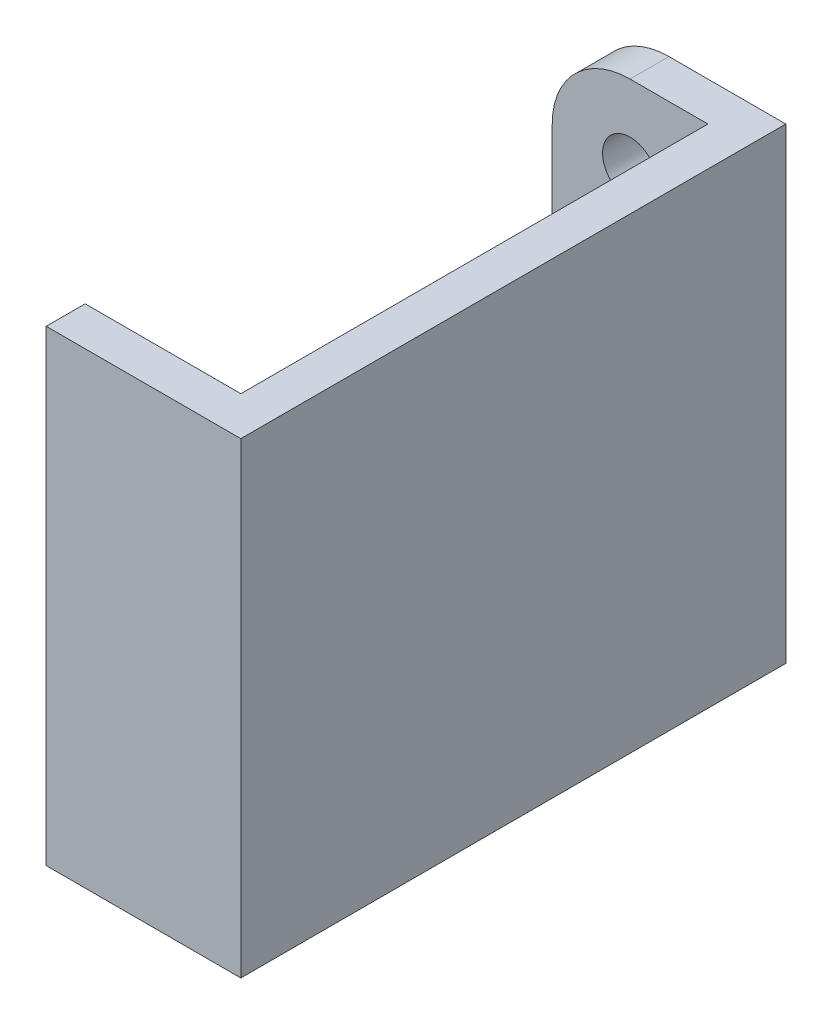
ISO-10303-21;
HEADER;
FILE_DESCRIPTION(('STEP AP214'),'2;1');
FILE_NAME('part.step','',(''),(''),'','','');
FILE_SCHEMA(('AUTOMOTIVE_DESIGN { 1 0 10303 214 1 1 1 1 }'));
ENDSEC;
DATA;
#1=APPLICATION_CONTEXT('core data for automotive mechanical design processes');
#2=APPLICATION_PROTOCOL_DEFINITION('international standard','automotive_design',2000,#1);
#3=PRODUCT_CONTEXT('',#1,'mechanical');
#4=PRODUCT('Part','Part','',(#3));
#5=PRODUCT_RELATED_PRODUCT_CATEGORY('part','',(#4));
#6=PRODUCT_DEFINITION_FORMATION('','',#4);
#7=PRODUCT_DEFINITION_CONTEXT('part definition',#1,'design');
#8=PRODUCT_DEFINITION('design','',#6,#7);
#9=PRODUCT_DEFINITION_SHAPE('','',#8);
#10=(LENGTH_UNIT() NAMED_UNIT(*) SI_UNIT(.MILLI.,.METRE.));
#11=(NAMED_UNIT(*) PLANE_ANGLE_UNIT() SI_UNIT($,.RADIAN.));
#12=(NAMED_UNIT(*) SI_UNIT($,.STERADIAN.) SOLID_ANGLE_UNIT());
#13=UNCERTAINTY_MEASURE_WITH_UNIT(LENGTH_MEASURE(1.E-05),#10,'distance_accuracy_value','');
#14=(GEOMETRIC_REPRESENTATION_CONTEXT(3) GLOBAL_UNCERTAINTY_ASSIGNED_CONTEXT((#13)) GLOBAL_UNIT_ASSIGNED_CONTEXT((#10,
#11,#12)) REPRESENTATION_CONTEXT('',''));
#15=CARTESIAN_POINT('',(0.,0.,0.));
#16=DIRECTION('',(0.,0.,1.));
#17=DIRECTION('',(1.,0.,0.));
#18=AXIS2_PLACEMENT_3D('',#15,#16,#17);
#19=CARTESIAN_POINT('',(-7.9375,19.05,-44.45));
#20=DIRECTION('',(-1.,0.,0.));
#21=DIRECTION('',(0.,-1.,0.));
#22=AXIS2_PLACEMENT_3D('',#19,#20,#21);
#23=PLANE('',#22);
#24=DIRECTION('',(0.,-1.,0.));
#25=VECTOR('',#24,1.);
#26=CARTESIAN_POINT('',(-7.9375,0.,-41.275));
#27=LINE('',#26,#25);
#28=CARTESIAN_POINT('',(-7.9375,12.7,-41.275));
#29=VERTEX_POINT('',#28);
#30=CARTESIAN_POINT('',(-7.9375,-15.875,-41.275));
#31=VERTEX_POINT('',#30);
#32=EDGE_CURVE('E138',#29,#31,#27,.T.);
#33=ORIENTED_EDGE('',*,*,#32,.F.);
#34=DIRECTION('',(0.,0.,1.));
#35=VECTOR('',#34,1.);
#36=CARTESIAN_POINT('',(-7.9375,12.7,-44.45));
#37=LINE('',#36,#35);
#38=CARTESIAN_POINT('',(-7.9375,12.7,-44.45));
#39=VERTEX_POINT('',#38);
#40=EDGE_CURVE('E52',#29,#39,#37,.F.);
#41=ORIENTED_EDGE('',*,*,#40,.T.);
#42=DIRECTION('',(0.,-1.,0.));
#43=VECTOR('',#42,1.);
#44=CARTESIAN_POINT('',(-7.9375,19.05,-44.45));
#45=LINE('',#44,#43);
#46=CARTESIAN_POINT('',(-7.9375,-19.05,-44.45));
#47=VERTEX_POINT('',#46);
#48=EDGE_CURVE('E169',#39,#47,#45,.T.);
#49=ORIENTED_EDGE('',*,*,#48,.T.);
#50=DIRECTION('',(0.,0.,1.));
#51=VECTOR('',#50,1.);
#52=CARTESIAN_POINT('',(-7.9375,-19.05,-44.45));
#53=LINE('',#52,#51);
#54=CARTESIAN_POINT('',(-7.9375,-19.05,0.));
#55=VERTEX_POINT('',#54);
#56=EDGE_CURVE('E195',#47,#55,#53,.T.);
#57=ORIENTED_EDGE('',*,*,#56,.T.);
#58=DIRECTION('',(0.,-1.,0.));
#59=VECTOR('',#58,1.);
#60=CARTESIAN_POINT('',(-7.9375,19.05,0.));
#61=LINE('',#60,#59);
#62=CARTESIAN_POINT('',(-7.9375,19.05,0.));
#63=VERTEX_POINT('',#62);
#64=EDGE_CURVE('E184',#63,#55,#61,.T.);
#65=ORIENTED_EDGE('',*,*,#64,.F.);
#66=DIRECTION('',(0.,0.,1.));
#67=VECTOR('',#66,1.);
#68=CARTESIAN_POINT('',(-7.9375,19.05,-44.45));
#69=LINE('',#68,#67);
#70=CARTESIAN_POINT('',(-7.9375,19.05,-3.175));
#71=VERTEX_POINT('',#70);
#72=EDGE_CURVE('E198',#71,#63,#69,.T.);
#73=ORIENTED_EDGE('',*,*,#72,.F.);
#74=DIRECTION('',(0.,-1.,0.));
#75=VECTOR('',#74,1.);
#76=CARTESIAN_POINT('',(-7.9375,0.,-3.175));
#77=LINE('',#76,#75);
#78=CARTESIAN_POINT('',(-7.9375,-15.875,-3.175));
#79=VERTEX_POINT('',#78);
#80=EDGE_CURVE('E151',#71,#79,#77,.T.);
#81=ORIENTED_EDGE('',*,*,#80,.T.);
#82=DIRECTION('',(0.,0.,1.));
#83=VECTOR('',#82,1.);
#84=CARTESIAN_POINT('',(-7.9375,-15.875,-44.45));
#85=LINE('',#84,#83);
#86=EDGE_CURVE('E126',#31,#79,#85,.T.);
#87=ORIENTED_EDGE('',*,*,#86,.F.);
#88=EDGE_LOOP('',(#33,#41,#49,#57,#65,#73,#81,#87));
#89=FACE_BOUND('',#88,.T.);
#90=ADVANCED_FACE('F43',(#89),#23,.T.);
#91=CARTESIAN_POINT('',(-7.9375,19.05,-44.45));
#92=DIRECTION('',(0.,1.,0.));
#93=DIRECTION('',(0.,0.,1.));
#94=AXIS2_PLACEMENT_3D('',#91,#92,#93);
#95=PLANE('',#94);
#96=DIRECTION('',(-1.,0.,0.));
#97=VECTOR('',#96,1.);
#98=CARTESIAN_POINT('',(-7.9375,19.05,-44.45));
#99=LINE('',#98,#97);
#100=CARTESIAN_POINT('',(7.9375,19.05,-44.45));
#101=VERTEX_POINT('',#100);
#102=CARTESIAN_POINT('',(-1.5875,19.05,-44.45));
#103=VERTEX_POINT('',#102);
#104=EDGE_CURVE('E164',#101,#103,#99,.T.);
#105=ORIENTED_EDGE('',*,*,#104,.T.);
#106=DIRECTION('',(0.,0.,1.));
#107=VECTOR('',#106,1.);
#108=CARTESIAN_POINT('',(-1.5875,19.05,-44.45));
#109=LINE('',#108,#107);
#110=CARTESIAN_POINT('',(-1.5875,19.05,-41.275));
#111=VERTEX_POINT('',#110);
#112=EDGE_CURVE('E194',#103,#111,#109,.T.);
#113=ORIENTED_EDGE('',*,*,#112,.T.);
#114=DIRECTION('',(-1.,0.,0.));
#115=VECTOR('',#114,1.);
#116=CARTESIAN_POINT('',(0.,19.05,-41.275));
#117=LINE('',#116,#115);
#118=CARTESIAN_POINT('',(4.7625,19.05,-41.275));
#119=VERTEX_POINT('',#118);
#120=EDGE_CURVE('E135',#119,#111,#117,.T.);
#121=ORIENTED_EDGE('',*,*,#120,.F.);
#122=DIRECTION('',(0.,0.,1.));
#123=VECTOR('',#122,1.);
#124=CARTESIAN_POINT('',(4.7625,19.05,-44.45));
#125=LINE('',#124,#123);
#126=CARTESIAN_POINT('',(4.7625,19.05,-3.175));
#127=VERTEX_POINT('',#126);
#128=EDGE_CURVE('E132',#119,#127,#125,.T.);
#129=ORIENTED_EDGE('',*,*,#128,.T.);
#130=DIRECTION('',(-1.,0.,0.));
#131=VECTOR('',#130,1.);
#132=CARTESIAN_POINT('',(0.,19.05,-3.175));
#133=LINE('',#132,#131);
#134=EDGE_CURVE('E155',#127,#71,#133,.T.);
#135=ORIENTED_EDGE('',*,*,#134,.T.);
#136=ORIENTED_EDGE('',*,*,#72,.T.);
#137=DIRECTION('',(-1.,0.,0.));
#138=VECTOR('',#137,1.);
#139=CARTESIAN_POINT('',(-7.9375,19.05,0.));
#140=LINE('',#139,#138);
#141=CARTESIAN_POINT('',(7.9375,19.05,0.));
#142=VERTEX_POINT('',#141);
#143=EDGE_CURVE('E180',#142,#63,#140,.T.);
#144=ORIENTED_EDGE('',*,*,#143,.F.);
#145=DIRECTION('',(0.,0.,1.));
#146=VECTOR('',#145,1.);
#147=CARTESIAN_POINT('',(7.9375,19.05,-44.45));
#148=LINE('',#147,#146);
#149=EDGE_CURVE('E176',#101,#142,#148,.T.);
#150=ORIENTED_EDGE('',*,*,#149,.F.);
#151=EDGE_LOOP('',(#105,#113,#121,#129,#135,#136,#144,#150));
#152=FACE_BOUND('',#151,.T.);
#153=ADVANCED_FACE('F210',(#152),#95,.T.);
#154=CARTESIAN_POINT('',(7.9375,19.05,-44.45));
#155=DIRECTION('',(1.,0.,0.));
#156=DIRECTION('',(0.,1.,0.));
#157=AXIS2_PLACEMENT_3D('',#154,#155,#156);
#158=PLANE('',#157);
#159=DIRECTION('',(0.,1.,0.));
#160=VECTOR('',#159,1.);
#161=CARTESIAN_POINT('',(7.9375,19.05,0.));
#162=LINE('',#161,#160);
#163=CARTESIAN_POINT('',(7.9375,-19.05,0.));
#164=VERTEX_POINT('',#163);
#165=EDGE_CURVE('E125',#164,#142,#162,.T.);
#166=ORIENTED_EDGE('',*,*,#165,.F.);
#167=DIRECTION('',(0.,0.,1.));
#168=VECTOR('',#167,1.);
#169=CARTESIAN_POINT('',(7.9375,-19.05,-44.45));
#170=LINE('',#169,#168);
#171=CARTESIAN_POINT('',(7.9375,-19.05,-44.45));
#172=VERTEX_POINT('',#171);
#173=EDGE_CURVE('E191',#172,#164,#170,.T.);
#174=ORIENTED_EDGE('',*,*,#173,.F.);
#175=DIRECTION('',(0.,1.,0.));
#176=VECTOR('',#175,1.);
#177=CARTESIAN_POINT('',(7.9375,19.05,-44.45));
#178=LINE('',#177,#176);
#179=EDGE_CURVE('E160',#172,#101,#178,.T.);
#180=ORIENTED_EDGE('',*,*,#179,.T.);
#181=ORIENTED_EDGE('',*,*,#149,.T.);
#182=EDGE_LOOP('',(#166,#174,#180,#181));
#183=FACE_BOUND('',#182,.T.);
#184=ADVANCED_FACE('F278',(#183),#158,.T.);
#185=CARTESIAN_POINT('',(-7.9375,-19.05,-44.45));
#186=DIRECTION('',(0.,-1.,0.));
#187=DIRECTION('',(0.,0.,-1.));
#188=AXIS2_PLACEMENT_3D('',#185,#186,#187);
#189=PLANE('',#188);
#190=DIRECTION('',(1.,0.,0.));
#191=VECTOR('',#190,1.);
#192=CARTESIAN_POINT('',(-7.9375,-19.05,0.));
#193=LINE('',#192,#191);
#194=EDGE_CURVE('E165',#55,#164,#193,.T.);
#195=ORIENTED_EDGE('',*,*,#194,.F.);
#196=ORIENTED_EDGE('',*,*,#56,.F.);
#197=DIRECTION('',(1.,0.,0.));
#198=VECTOR('',#197,1.);
#199=CARTESIAN_POINT('',(-7.9375,-19.05,-44.45));
#200=LINE('',#199,#198);
#201=EDGE_CURVE('E172',#47,#172,#200,.T.);
#202=ORIENTED_EDGE('',*,*,#201,.T.);
#203=ORIENTED_EDGE('',*,*,#173,.T.);
#204=EDGE_LOOP('',(#195,#196,#202,#203));
#205=FACE_BOUND('',#204,.T.);
#206=ADVANCED_FACE('F222',(#205),#189,.T.);
#207=CARTESIAN_POINT('',(0.,0.,-44.45));
#208=DIRECTION('',(0.,0.,1.));
#209=DIRECTION('',(1.,0.,0.));
#210=AXIS2_PLACEMENT_3D('',#207,#208,#209);
#211=PLANE('',#210);
#212=CARTESIAN_POINT('',(-1.5875,-6.35000000000001,-44.45));
#213=DIRECTION('',(0.,0.,1.));
#214=DIRECTION('',(1.,0.,0.));
#215=AXIS2_PLACEMENT_3D('',#212,#213,#214);
#216=CIRCLE('',#215,2.2479);
#217=CARTESIAN_POINT('',(0.660399999999998,-6.35000000000001,-44.45));
#218=VERTEX_POINT('',#217);
#219=EDGE_CURVE('E231',#218,#218,#216,.F.);
#220=ORIENTED_EDGE('',*,*,#219,.F.);
#221=EDGE_LOOP('',(#220));
#222=FACE_BOUND('',#221,.T.);
#223=CARTESIAN_POINT('',(-1.5875,12.7,-44.45));
#224=DIRECTION('',(0.,0.,1.));
#225=DIRECTION('',(1.,0.,0.));
#226=AXIS2_PLACEMENT_3D('',#223,#224,#225);
#227=CIRCLE('',#226,2.2479);
#228=CARTESIAN_POINT('',(0.660399999999998,12.7,-44.45));
#229=VERTEX_POINT('',#228);
#230=EDGE_CURVE('E242',#229,#229,#227,.F.);
#231=ORIENTED_EDGE('',*,*,#230,.F.);
#232=EDGE_LOOP('',(#231));
#233=FACE_BOUND('',#232,.T.);
#234=ORIENTED_EDGE('',*,*,#48,.F.);
#235=CARTESIAN_POINT('',(-1.5875,12.7,-44.45));
#236=DIRECTION('',(0.,0.,1.));
#237=DIRECTION('',(1.,0.,0.));
#238=AXIS2_PLACEMENT_3D('',#235,#236,#237);
#239=CIRCLE('',#238,6.35);
#240=EDGE_CURVE('E11',#39,#103,#239,.F.);
#241=ORIENTED_EDGE('',*,*,#240,.T.);
#242=ORIENTED_EDGE('',*,*,#104,.F.);
#243=ORIENTED_EDGE('',*,*,#179,.F.);
#244=ORIENTED_EDGE('',*,*,#201,.F.);
#245=EDGE_LOOP('',(#234,#241,#242,#243,#244));
#246=FACE_BOUND('',#245,.T.);
#247=ADVANCED_FACE('F215',(#222,#233,#246),#211,.F.);
#248=CARTESIAN_POINT('',(0.,0.,0.));
#249=DIRECTION('',(0.,0.,1.));
#250=DIRECTION('',(1.,0.,0.));
#251=AXIS2_PLACEMENT_3D('',#248,#249,#250);
#252=PLANE('',#251);
#253=ORIENTED_EDGE('',*,*,#165,.T.);
#254=ORIENTED_EDGE('',*,*,#143,.T.);
#255=ORIENTED_EDGE('',*,*,#64,.T.);
#256=ORIENTED_EDGE('',*,*,#194,.T.);
#257=EDGE_LOOP('',(#253,#254,#255,#256));
#258=FACE_BOUND('',#257,.T.);
#259=ADVANCED_FACE('F225',(#258),#252,.T.);
#260=CARTESIAN_POINT('',(4.7625,19.05,-44.45));
#261=DIRECTION('',(1.,0.,0.));
#262=DIRECTION('',(0.,1.,0.));
#263=AXIS2_PLACEMENT_3D('',#260,#261,#262);
#264=PLANE('',#263);
#265=DIRECTION('',(0.,1.,0.));
#266=VECTOR('',#265,1.);
#267=CARTESIAN_POINT('',(4.7625,0.,-3.175));
#268=LINE('',#267,#266);
#269=CARTESIAN_POINT('',(4.7625,-15.875,-3.175));
#270=VERTEX_POINT('',#269);
#271=EDGE_CURVE('E159',#270,#127,#268,.T.);
#272=ORIENTED_EDGE('',*,*,#271,.T.);
#273=ORIENTED_EDGE('',*,*,#128,.F.);
#274=DIRECTION('',(0.,1.,0.));
#275=VECTOR('',#274,1.);
#276=CARTESIAN_POINT('',(4.7625,0.,-41.275));
#277=LINE('',#276,#275);
#278=CARTESIAN_POINT('',(4.7625,-15.875,-41.275));
#279=VERTEX_POINT('',#278);
#280=EDGE_CURVE('E129',#279,#119,#277,.T.);
#281=ORIENTED_EDGE('',*,*,#280,.F.);
#282=DIRECTION('',(0.,0.,1.));
#283=VECTOR('',#282,1.);
#284=CARTESIAN_POINT('',(4.7625,-15.875,-44.45));
#285=LINE('',#284,#283);
#286=EDGE_CURVE('E113',#279,#270,#285,.T.);
#287=ORIENTED_EDGE('',*,*,#286,.T.);
#288=EDGE_LOOP('',(#272,#273,#281,#287));
#289=FACE_BOUND('',#288,.T.);
#290=ADVANCED_FACE('F130',(#289),#264,.F.);
#291=CARTESIAN_POINT('',(-7.9375,-15.875,-44.45));
#292=DIRECTION('',(0.,-1.,0.));
#293=DIRECTION('',(0.,0.,-1.));
#294=AXIS2_PLACEMENT_3D('',#291,#292,#293);
#295=PLANE('',#294);
#296=DIRECTION('',(1.,0.,0.));
#297=VECTOR('',#296,1.);
#298=CARTESIAN_POINT('',(0.,-15.875,-3.175));
#299=LINE('',#298,#297);
#300=EDGE_CURVE('E120',#79,#270,#299,.T.);
#301=ORIENTED_EDGE('',*,*,#300,.T.);
#302=ORIENTED_EDGE('',*,*,#286,.F.);
#303=DIRECTION('',(1.,0.,0.));
#304=VECTOR('',#303,1.);
#305=CARTESIAN_POINT('',(0.,-15.875,-41.275));
#306=LINE('',#305,#304);
#307=EDGE_CURVE('E117',#31,#279,#306,.T.);
#308=ORIENTED_EDGE('',*,*,#307,.F.);
#309=ORIENTED_EDGE('',*,*,#86,.T.);
#310=EDGE_LOOP('',(#301,#302,#308,#309));
#311=FACE_BOUND('',#310,.T.);
#312=ADVANCED_FACE('F115',(#311),#295,.F.);
#313=CARTESIAN_POINT('',(0.,0.,-41.275));
#314=DIRECTION('',(0.,0.,1.));
#315=DIRECTION('',(1.,0.,0.));
#316=AXIS2_PLACEMENT_3D('',#313,#314,#315);
#317=PLANE('',#316);
#318=CARTESIAN_POINT('',(-1.5875,-6.35000000000001,-41.275));
#319=DIRECTION('',(0.,0.,1.));
#320=DIRECTION('',(1.,0.,0.));
#321=AXIS2_PLACEMENT_3D('',#318,#319,#320);
#322=CIRCLE('',#321,2.2479);
#323=CARTESIAN_POINT('',(0.660399999999998,-6.35000000000001,-41.275));
#324=VERTEX_POINT('',#323);
#325=EDGE_CURVE('E235',#324,#324,#322,.F.);
#326=ORIENTED_EDGE('',*,*,#325,.T.);
#327=EDGE_LOOP('',(#326));
#328=FACE_BOUND('',#327,.T.);
#329=CARTESIAN_POINT('',(-1.5875,12.7,-41.275));
#330=DIRECTION('',(0.,0.,1.));
#331=DIRECTION('',(1.,0.,0.));
#332=AXIS2_PLACEMENT_3D('',#329,#330,#331);
#333=CIRCLE('',#332,2.2479);
#334=CARTESIAN_POINT('',(0.660399999999998,12.7,-41.275));
#335=VERTEX_POINT('',#334);
#336=EDGE_CURVE('E238',#335,#335,#333,.F.);
#337=ORIENTED_EDGE('',*,*,#336,.T.);
#338=EDGE_LOOP('',(#337));
#339=FACE_BOUND('',#338,.T.);
#340=ORIENTED_EDGE('',*,*,#120,.T.);
#341=CARTESIAN_POINT('',(-1.5875,12.7,-41.275));
#342=DIRECTION('',(0.,0.,1.));
#343=DIRECTION('',(1.,0.,0.));
#344=AXIS2_PLACEMENT_3D('',#341,#342,#343);
#345=CIRCLE('',#344,6.35);
#346=EDGE_CURVE('E66',#111,#29,#345,.T.);
#347=ORIENTED_EDGE('',*,*,#346,.T.);
#348=ORIENTED_EDGE('',*,*,#32,.T.);
#349=ORIENTED_EDGE('',*,*,#307,.T.);
#350=ORIENTED_EDGE('',*,*,#280,.T.);
#351=EDGE_LOOP('',(#340,#347,#348,#349,#350));
#352=FACE_BOUND('',#351,.T.);
#353=ADVANCED_FACE('F137',(#328,#339,#352),#317,.T.);
#354=CARTESIAN_POINT('',(0.,0.,-3.175));
#355=DIRECTION('',(0.,0.,1.));
#356=DIRECTION('',(1.,0.,0.));
#357=AXIS2_PLACEMENT_3D('',#354,#355,#356);
#358=PLANE('',#357);
#359=ORIENTED_EDGE('',*,*,#271,.F.);
#360=ORIENTED_EDGE('',*,*,#300,.F.);
#361=ORIENTED_EDGE('',*,*,#80,.F.);
#362=ORIENTED_EDGE('',*,*,#134,.F.);
#363=EDGE_LOOP('',(#359,#360,#361,#362));
#364=FACE_BOUND('',#363,.T.);
#365=ADVANCED_FACE('F229',(#364),#358,.F.);
#366=CARTESIAN_POINT('',(-1.5875,12.7,-44.451));
#367=DIRECTION('',(0.,0.,1.));
#368=DIRECTION('',(1.,0.,0.));
#369=AXIS2_PLACEMENT_3D('',#366,#367,#368);
#370=CYLINDRICAL_SURFACE('',#369,2.2479);
#371=ORIENTED_EDGE('',*,*,#336,.F.);
#372=EDGE_LOOP('',(#371));
#373=FACE_BOUND('',#372,.T.);
#374=ORIENTED_EDGE('',*,*,#230,.T.);
#375=EDGE_LOOP('',(#374));
#376=FACE_BOUND('',#375,.T.);
#377=ADVANCED_FACE('F255',(#373,#376),#370,.F.);
#378=CARTESIAN_POINT('',(-1.5875,-6.35000000000001,-44.451));
#379=DIRECTION('',(0.,0.,1.));
#380=DIRECTION('',(1.,0.,0.));
#381=AXIS2_PLACEMENT_3D('',#378,#379,#380);
#382=CYLINDRICAL_SURFACE('',#381,2.2479);
#383=ORIENTED_EDGE('',*,*,#325,.F.);
#384=EDGE_LOOP('',(#383));
#385=FACE_BOUND('',#384,.T.);
#386=ORIENTED_EDGE('',*,*,#219,.T.);
#387=EDGE_LOOP('',(#386));
#388=FACE_BOUND('',#387,.T.);
#389=ADVANCED_FACE('F252',(#385,#388),#382,.F.);
#390=CARTESIAN_POINT('',(-1.5875,12.7,-44.45));
#391=DIRECTION('',(0.,0.,1.));
#392=DIRECTION('',(1.,0.,0.));
#393=AXIS2_PLACEMENT_3D('',#390,#391,#392);
#394=CYLINDRICAL_SURFACE('',#393,6.35);
#395=ORIENTED_EDGE('',*,*,#240,.F.);
#396=ORIENTED_EDGE('',*,*,#40,.F.);
#397=ORIENTED_EDGE('',*,*,#346,.F.);
#398=ORIENTED_EDGE('',*,*,#112,.F.);
#399=EDGE_LOOP('',(#395,#396,#397,#398));
#400=FACE_BOUND('',#399,.T.);
#401=ADVANCED_FACE('F45',(#400),#394,.T.);
#402=CLOSED_SHELL('',(#90,#153,#184,#206,#247,#259,#290,#312,#353,#365,#377,#389,#401));
#403=MANIFOLD_SOLID_BREP('B2',#402);
#404=ADVANCED_BREP_SHAPE_REPRESENTATION('',(#18,#403),#14);
#405=SHAPE_DEFINITION_REPRESENTATION(#9,#404);
ENDSEC;
END-ISO-10303-21;
